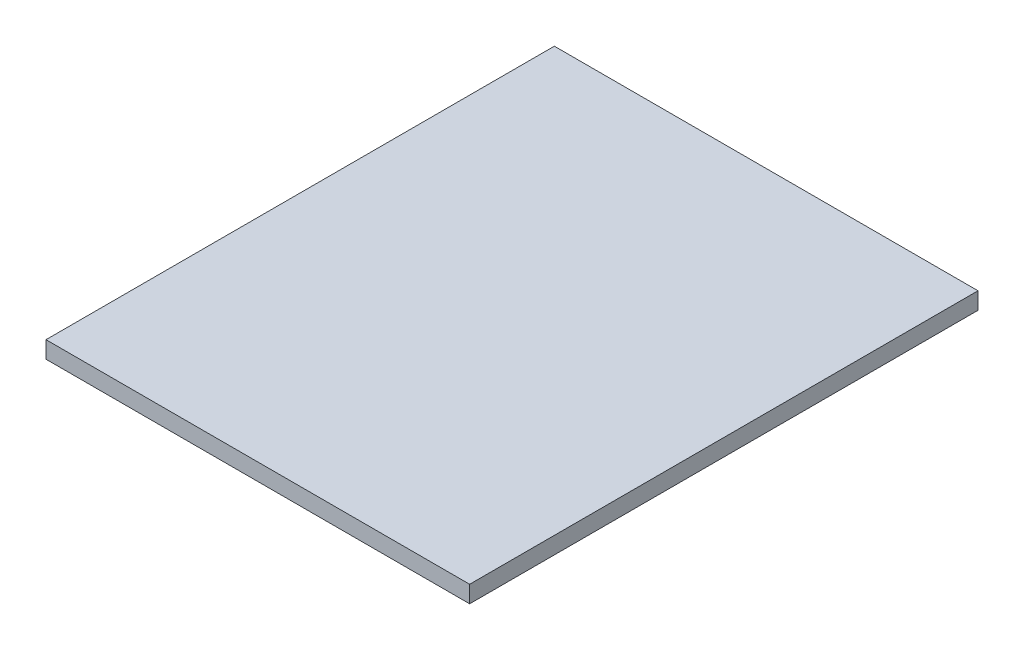
ISO-10303-21;
HEADER;
FILE_DESCRIPTION(('STEP AP214'),'2;1');
FILE_NAME('part.step','',(''),(''),'','','');
FILE_SCHEMA(('AUTOMOTIVE_DESIGN { 1 0 10303 214 1 1 1 1 }'));
ENDSEC;
DATA;
#1=APPLICATION_CONTEXT('core data for automotive mechanical design processes');
#2=APPLICATION_PROTOCOL_DEFINITION('international standard','automotive_design',2000,#1);
#3=PRODUCT_CONTEXT('',#1,'mechanical');
#4=PRODUCT('Part','Part','',(#3));
#5=PRODUCT_RELATED_PRODUCT_CATEGORY('part','',(#4));
#6=PRODUCT_DEFINITION_FORMATION('','',#4);
#7=PRODUCT_DEFINITION_CONTEXT('part definition',#1,'design');
#8=PRODUCT_DEFINITION('design','',#6,#7);
#9=PRODUCT_DEFINITION_SHAPE('','',#8);
#10=(LENGTH_UNIT() NAMED_UNIT(*) SI_UNIT(.MILLI.,.METRE.));
#11=(NAMED_UNIT(*) PLANE_ANGLE_UNIT() SI_UNIT($,.RADIAN.));
#12=(NAMED_UNIT(*) SI_UNIT($,.STERADIAN.) SOLID_ANGLE_UNIT());
#13=UNCERTAINTY_MEASURE_WITH_UNIT(LENGTH_MEASURE(1.E-05),#10,'distance_accuracy_value','');
#14=(GEOMETRIC_REPRESENTATION_CONTEXT(3) GLOBAL_UNCERTAINTY_ASSIGNED_CONTEXT((#13)) GLOBAL_UNIT_ASSIGNED_CONTEXT((#10,
#11,#12)) REPRESENTATION_CONTEXT('',''));
#15=CARTESIAN_POINT('',(0.,0.,0.));
#16=DIRECTION('',(0.,0.,1.));
#17=DIRECTION('',(1.,0.,0.));
#18=AXIS2_PLACEMENT_3D('',#15,#16,#17);
#19=CARTESIAN_POINT('',(500.,40.,-600.));
#20=DIRECTION('',(-1.,0.,0.));
#21=DIRECTION('',(0.,0.,1.));
#22=AXIS2_PLACEMENT_3D('',#19,#20,#21);
#23=PLANE('',#22);
#24=DIRECTION('',(0.,0.,-1.));
#25=VECTOR('',#24,1.);
#26=CARTESIAN_POINT('',(500.,0.,-600.));
#27=LINE('',#26,#25);
#28=CARTESIAN_POINT('',(500.,0.,600.));
#29=VERTEX_POINT('',#28);
#30=CARTESIAN_POINT('',(500.,0.,-600.));
#31=VERTEX_POINT('',#30);
#32=EDGE_CURVE('E96',#29,#31,#27,.T.);
#33=ORIENTED_EDGE('',*,*,#32,.T.);
#34=DIRECTION('',(0.,-1.,0.));
#35=VECTOR('',#34,1.);
#36=CARTESIAN_POINT('',(500.,40.,-600.));
#37=LINE('',#36,#35);
#38=CARTESIAN_POINT('',(500.,40.,-600.));
#39=VERTEX_POINT('',#38);
#40=EDGE_CURVE('E11',#39,#31,#37,.T.);
#41=ORIENTED_EDGE('',*,*,#40,.F.);
#42=DIRECTION('',(0.,0.,-1.));
#43=VECTOR('',#42,1.);
#44=CARTESIAN_POINT('',(500.,40.,-600.));
#45=LINE('',#44,#43);
#46=CARTESIAN_POINT('',(500.,40.,600.));
#47=VERTEX_POINT('',#46);
#48=EDGE_CURVE('E84',#47,#39,#45,.T.);
#49=ORIENTED_EDGE('',*,*,#48,.F.);
#50=DIRECTION('',(0.,-1.,0.));
#51=VECTOR('',#50,1.);
#52=CARTESIAN_POINT('',(500.,40.,600.));
#53=LINE('',#52,#51);
#54=EDGE_CURVE('E92',#47,#29,#53,.T.);
#55=ORIENTED_EDGE('',*,*,#54,.T.);
#56=EDGE_LOOP('',(#33,#41,#49,#55));
#57=FACE_BOUND('',#56,.T.);
#58=ADVANCED_FACE('F33',(#57),#23,.F.);
#59=CARTESIAN_POINT('',(-500.,40.,-600.));
#60=DIRECTION('',(0.,0.,1.));
#61=DIRECTION('',(1.,0.,0.));
#62=AXIS2_PLACEMENT_3D('',#59,#60,#61);
#63=PLANE('',#62);
#64=DIRECTION('',(-1.,0.,0.));
#65=VECTOR('',#64,1.);
#66=CARTESIAN_POINT('',(-500.,0.,-600.));
#67=LINE('',#66,#65);
#68=CARTESIAN_POINT('',(-500.,0.,-600.));
#69=VERTEX_POINT('',#68);
#70=EDGE_CURVE('E88',#31,#69,#67,.T.);
#71=ORIENTED_EDGE('',*,*,#70,.T.);
#72=DIRECTION('',(0.,-1.,0.));
#73=VECTOR('',#72,1.);
#74=CARTESIAN_POINT('',(-500.,40.,-600.));
#75=LINE('',#74,#73);
#76=CARTESIAN_POINT('',(-500.,40.,-600.));
#77=VERTEX_POINT('',#76);
#78=EDGE_CURVE('E41',#77,#69,#75,.T.);
#79=ORIENTED_EDGE('',*,*,#78,.F.);
#80=DIRECTION('',(-1.,0.,0.));
#81=VECTOR('',#80,1.);
#82=CARTESIAN_POINT('',(-500.,40.,-600.));
#83=LINE('',#82,#81);
#84=EDGE_CURVE('E79',#39,#77,#83,.T.);
#85=ORIENTED_EDGE('',*,*,#84,.F.);
#86=ORIENTED_EDGE('',*,*,#40,.T.);
#87=EDGE_LOOP('',(#71,#79,#85,#86));
#88=FACE_BOUND('',#87,.T.);
#89=ADVANCED_FACE('F87',(#88),#63,.F.);
#90=CARTESIAN_POINT('',(-500.,40.,-600.));
#91=DIRECTION('',(1.,0.,0.));
#92=DIRECTION('',(0.,0.,-1.));
#93=AXIS2_PLACEMENT_3D('',#90,#91,#92);
#94=PLANE('',#93);
#95=DIRECTION('',(0.,0.,1.));
#96=VECTOR('',#95,1.);
#97=CARTESIAN_POINT('',(-500.,0.,-600.));
#98=LINE('',#97,#96);
#99=CARTESIAN_POINT('',(-500.,0.,600.));
#100=VERTEX_POINT('',#99);
#101=EDGE_CURVE('E66',#69,#100,#98,.T.);
#102=ORIENTED_EDGE('',*,*,#101,.T.);
#103=DIRECTION('',(0.,-1.,0.));
#104=VECTOR('',#103,1.);
#105=CARTESIAN_POINT('',(-500.,40.,600.));
#106=LINE('',#105,#104);
#107=CARTESIAN_POINT('',(-500.,40.,600.));
#108=VERTEX_POINT('',#107);
#109=EDGE_CURVE('E89',#108,#100,#106,.T.);
#110=ORIENTED_EDGE('',*,*,#109,.F.);
#111=DIRECTION('',(0.,0.,1.));
#112=VECTOR('',#111,1.);
#113=CARTESIAN_POINT('',(-500.,40.,-600.));
#114=LINE('',#113,#112);
#115=EDGE_CURVE('E82',#77,#108,#114,.T.);
#116=ORIENTED_EDGE('',*,*,#115,.F.);
#117=ORIENTED_EDGE('',*,*,#78,.T.);
#118=EDGE_LOOP('',(#102,#110,#116,#117));
#119=FACE_BOUND('',#118,.T.);
#120=ADVANCED_FACE('F90',(#119),#94,.F.);
#121=CARTESIAN_POINT('',(-500.,40.,600.));
#122=DIRECTION('',(0.,0.,-1.));
#123=DIRECTION('',(-1.,0.,0.));
#124=AXIS2_PLACEMENT_3D('',#121,#122,#123);
#125=PLANE('',#124);
#126=DIRECTION('',(1.,0.,0.));
#127=VECTOR('',#126,1.);
#128=CARTESIAN_POINT('',(-500.,0.,600.));
#129=LINE('',#128,#127);
#130=EDGE_CURVE('E72',#100,#29,#129,.T.);
#131=ORIENTED_EDGE('',*,*,#130,.T.);
#132=ORIENTED_EDGE('',*,*,#54,.F.);
#133=DIRECTION('',(1.,0.,0.));
#134=VECTOR('',#133,1.);
#135=CARTESIAN_POINT('',(-500.,40.,600.));
#136=LINE('',#135,#134);
#137=EDGE_CURVE('E49',#108,#47,#136,.T.);
#138=ORIENTED_EDGE('',*,*,#137,.F.);
#139=ORIENTED_EDGE('',*,*,#109,.T.);
#140=EDGE_LOOP('',(#131,#132,#138,#139));
#141=FACE_BOUND('',#140,.T.);
#142=ADVANCED_FACE('F103',(#141),#125,.F.);
#143=CARTESIAN_POINT('',(0.,40.,0.));
#144=DIRECTION('',(0.,1.,0.));
#145=DIRECTION('',(0.,0.,1.));
#146=AXIS2_PLACEMENT_3D('',#143,#144,#145);
#147=PLANE('',#146);
#148=ORIENTED_EDGE('',*,*,#48,.T.);
#149=ORIENTED_EDGE('',*,*,#84,.T.);
#150=ORIENTED_EDGE('',*,*,#115,.T.);
#151=ORIENTED_EDGE('',*,*,#137,.T.);
#152=EDGE_LOOP('',(#148,#149,#150,#151));
#153=FACE_BOUND('',#152,.T.);
#154=ADVANCED_FACE('F80',(#153),#147,.T.);
#155=CARTESIAN_POINT('',(0.,0.,0.));
#156=DIRECTION('',(0.,1.,0.));
#157=DIRECTION('',(0.,0.,1.));
#158=AXIS2_PLACEMENT_3D('',#155,#156,#157);
#159=PLANE('',#158);
#160=ORIENTED_EDGE('',*,*,#32,.F.);
#161=ORIENTED_EDGE('',*,*,#130,.F.);
#162=ORIENTED_EDGE('',*,*,#101,.F.);
#163=ORIENTED_EDGE('',*,*,#70,.F.);
#164=EDGE_LOOP('',(#160,#161,#162,#163));
#165=FACE_BOUND('',#164,.T.);
#166=ADVANCED_FACE('F106',(#165),#159,.F.);
#167=CLOSED_SHELL('',(#58,#89,#120,#142,#154,#166));
#168=MANIFOLD_SOLID_BREP('B2',#167);
#169=ADVANCED_BREP_SHAPE_REPRESENTATION('',(#18,#168),#14);
#170=SHAPE_DEFINITION_REPRESENTATION(#9,#169);
ENDSEC;
END-ISO-10303-21;
